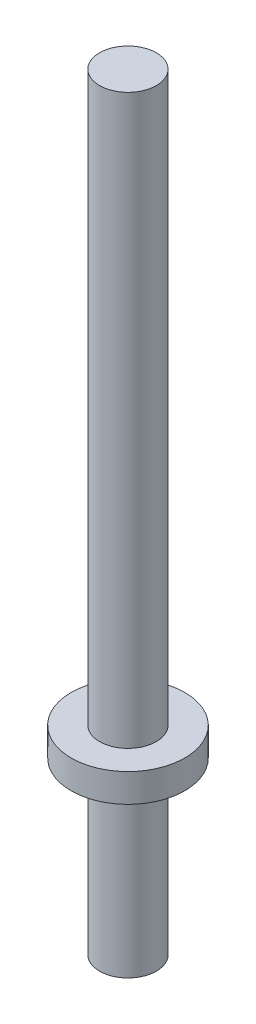
ISO-10303-21;
HEADER;
FILE_DESCRIPTION(('STEP AP214'),'2;1');
FILE_NAME('part.step','',(''),(''),'','','');
FILE_SCHEMA(('AUTOMOTIVE_DESIGN { 1 0 10303 214 1 1 1 1 }'));
ENDSEC;
DATA;
#1=APPLICATION_CONTEXT('core data for automotive mechanical design processes');
#2=APPLICATION_PROTOCOL_DEFINITION('international standard','automotive_design',2000,#1);
#3=PRODUCT_CONTEXT('',#1,'mechanical');
#4=PRODUCT('Part','Part','',(#3));
#5=PRODUCT_RELATED_PRODUCT_CATEGORY('part','',(#4));
#6=PRODUCT_DEFINITION_FORMATION('','',#4);
#7=PRODUCT_DEFINITION_CONTEXT('part definition',#1,'design');
#8=PRODUCT_DEFINITION('design','',#6,#7);
#9=PRODUCT_DEFINITION_SHAPE('','',#8);
#10=(LENGTH_UNIT() NAMED_UNIT(*) SI_UNIT(.MILLI.,.METRE.));
#11=(NAMED_UNIT(*) PLANE_ANGLE_UNIT() SI_UNIT($,.RADIAN.));
#12=(NAMED_UNIT(*) SI_UNIT($,.STERADIAN.) SOLID_ANGLE_UNIT());
#13=UNCERTAINTY_MEASURE_WITH_UNIT(LENGTH_MEASURE(1.E-05),#10,'distance_accuracy_value','');
#14=(GEOMETRIC_REPRESENTATION_CONTEXT(3) GLOBAL_UNCERTAINTY_ASSIGNED_CONTEXT((#13)) GLOBAL_UNIT_ASSIGNED_CONTEXT((#10,
#11,#12)) REPRESENTATION_CONTEXT('',''));
#15=CARTESIAN_POINT('',(0.,0.,0.));
#16=DIRECTION('',(0.,0.,1.));
#17=DIRECTION('',(1.,0.,0.));
#18=AXIS2_PLACEMENT_3D('',#15,#16,#17);
#19=CARTESIAN_POINT('',(-2.53,50.,-2.53));
#20=DIRECTION('',(0.,1.,0.));
#21=DIRECTION('',(0.,0.,1.));
#22=AXIS2_PLACEMENT_3D('',#19,#20,#21);
#23=PLANE('',#22);
#24=CARTESIAN_POINT('',(0.,50.,0.));
#25=DIRECTION('',(0.,-1.,0.));
#26=DIRECTION('',(0.,0.,-1.));
#27=AXIS2_PLACEMENT_3D('',#24,#25,#26);
#28=CIRCLE('',#27,2.5);
#29=CARTESIAN_POINT('',(0.,50.,-2.5));
#30=VERTEX_POINT('',#29);
#31=EDGE_CURVE('E18',#30,#30,#28,.F.);
#32=ORIENTED_EDGE('',*,*,#31,.T.);
#33=EDGE_LOOP('',(#32));
#34=FACE_BOUND('',#33,.T.);
#35=ADVANCED_FACE('F14',(#34),#23,.T.);
#36=CARTESIAN_POINT('',(0.,50.,0.));
#37=DIRECTION('',(0.,-1.,0.));
#38=DIRECTION('',(0.,0.,-1.));
#39=AXIS2_PLACEMENT_3D('',#36,#37,#38);
#40=CYLINDRICAL_SURFACE('',#39,2.5);
#41=CARTESIAN_POINT('',(0.,0.,0.));
#42=DIRECTION('',(0.,-1.,0.));
#43=DIRECTION('',(0.,0.,-1.));
#44=AXIS2_PLACEMENT_3D('',#41,#42,#43);
#45=CIRCLE('',#44,2.5);
#46=CARTESIAN_POINT('',(0.,0.,-2.5));
#47=VERTEX_POINT('',#46);
#48=EDGE_CURVE('E34',#47,#47,#45,.F.);
#49=ORIENTED_EDGE('',*,*,#48,.T.);
#50=EDGE_LOOP('',(#49));
#51=FACE_BOUND('',#50,.T.);
#52=ORIENTED_EDGE('',*,*,#31,.F.);
#53=EDGE_LOOP('',(#52));
#54=FACE_BOUND('',#53,.T.);
#55=ADVANCED_FACE('F42',(#51,#54),#40,.T.);
#56=CARTESIAN_POINT('',(-5.06,0.,5.06));
#57=DIRECTION('',(0.,-1.,0.));
#58=DIRECTION('',(0.,0.,-1.));
#59=AXIS2_PLACEMENT_3D('',#56,#57,#58);
#60=PLANE('',#59);
#61=ORIENTED_EDGE('',*,*,#48,.F.);
#62=EDGE_LOOP('',(#61));
#63=FACE_BOUND('',#62,.T.);
#64=CARTESIAN_POINT('',(0.,0.,0.));
#65=DIRECTION('',(0.,1.,0.));
#66=DIRECTION('',(-1.,0.,0.));
#67=AXIS2_PLACEMENT_3D('',#64,#65,#66);
#68=CIRCLE('',#67,5.);
#69=CARTESIAN_POINT('',(-5.,0.,0.));
#70=VERTEX_POINT('',#69);
#71=EDGE_CURVE('E32',#70,#70,#68,.T.);
#72=ORIENTED_EDGE('',*,*,#71,.T.);
#73=EDGE_LOOP('',(#72));
#74=FACE_BOUND('',#73,.T.);
#75=ADVANCED_FACE('F44',(#63,#74),#60,.F.);
#76=CARTESIAN_POINT('',(0.,-2.5,0.));
#77=DIRECTION('',(0.,1.,0.));
#78=DIRECTION('',(-1.,0.,0.));
#79=AXIS2_PLACEMENT_3D('',#76,#77,#78);
#80=CYLINDRICAL_SURFACE('',#79,5.);
#81=ORIENTED_EDGE('',*,*,#71,.F.);
#82=EDGE_LOOP('',(#81));
#83=FACE_BOUND('',#82,.T.);
#84=CARTESIAN_POINT('',(0.,-2.5,0.));
#85=DIRECTION('',(0.,1.,0.));
#86=DIRECTION('',(-1.,0.,0.));
#87=AXIS2_PLACEMENT_3D('',#84,#85,#86);
#88=CIRCLE('',#87,5.);
#89=CARTESIAN_POINT('',(-5.,-2.5,0.));
#90=VERTEX_POINT('',#89);
#91=EDGE_CURVE('E27',#90,#90,#88,.F.);
#92=ORIENTED_EDGE('',*,*,#91,.F.);
#93=EDGE_LOOP('',(#92));
#94=FACE_BOUND('',#93,.T.);
#95=ADVANCED_FACE('F51',(#83,#94),#80,.T.);
#96=CARTESIAN_POINT('',(-5.06,-2.5,5.06));
#97=DIRECTION('',(0.,-1.,0.));
#98=DIRECTION('',(0.,0.,-1.));
#99=AXIS2_PLACEMENT_3D('',#96,#97,#98);
#100=PLANE('',#99);
#101=CARTESIAN_POINT('',(0.,-2.5,0.));
#102=DIRECTION('',(0.,1.,0.));
#103=DIRECTION('',(0.,0.,1.));
#104=AXIS2_PLACEMENT_3D('',#101,#102,#103);
#105=CIRCLE('',#104,2.5);
#106=CARTESIAN_POINT('',(0.,-2.5,2.5));
#107=VERTEX_POINT('',#106);
#108=EDGE_CURVE('E22',#107,#107,#105,.T.);
#109=ORIENTED_EDGE('',*,*,#108,.T.);
#110=EDGE_LOOP('',(#109));
#111=FACE_BOUND('',#110,.T.);
#112=ORIENTED_EDGE('',*,*,#91,.T.);
#113=EDGE_LOOP('',(#112));
#114=FACE_BOUND('',#113,.T.);
#115=ADVANCED_FACE('F63',(#111,#114),#100,.T.);
#116=CARTESIAN_POINT('',(-2.53,-17.5,2.53));
#117=DIRECTION('',(0.,-1.,0.));
#118=DIRECTION('',(0.,0.,-1.));
#119=AXIS2_PLACEMENT_3D('',#116,#117,#118);
#120=PLANE('',#119);
#121=CARTESIAN_POINT('',(0.,-17.5,0.));
#122=DIRECTION('',(0.,1.,0.));
#123=DIRECTION('',(0.,0.,1.));
#124=AXIS2_PLACEMENT_3D('',#121,#122,#123);
#125=CIRCLE('',#124,2.5);
#126=CARTESIAN_POINT('',(0.,-17.5,2.5));
#127=VERTEX_POINT('',#126);
#128=EDGE_CURVE('E10',#127,#127,#125,.F.);
#129=ORIENTED_EDGE('',*,*,#128,.T.);
#130=EDGE_LOOP('',(#129));
#131=FACE_BOUND('',#130,.T.);
#132=ADVANCED_FACE('F16',(#131),#120,.T.);
#133=CARTESIAN_POINT('',(0.,-17.5,0.));
#134=DIRECTION('',(0.,1.,0.));
#135=DIRECTION('',(0.,0.,1.));
#136=AXIS2_PLACEMENT_3D('',#133,#134,#135);
#137=CYLINDRICAL_SURFACE('',#136,2.5);
#138=ORIENTED_EDGE('',*,*,#108,.F.);
#139=EDGE_LOOP('',(#138));
#140=FACE_BOUND('',#139,.T.);
#141=ORIENTED_EDGE('',*,*,#128,.F.);
#142=EDGE_LOOP('',(#141));
#143=FACE_BOUND('',#142,.T.);
#144=ADVANCED_FACE('F56',(#140,#143),#137,.T.);
#145=CLOSED_SHELL('',(#35,#55,#75,#95,#115,#132,#144));
#146=MANIFOLD_SOLID_BREP('B1',#145);
#147=ADVANCED_BREP_SHAPE_REPRESENTATION('',(#18,#146),#14);
#148=SHAPE_DEFINITION_REPRESENTATION(#9,#147);
ENDSEC;
END-ISO-10303-21;
